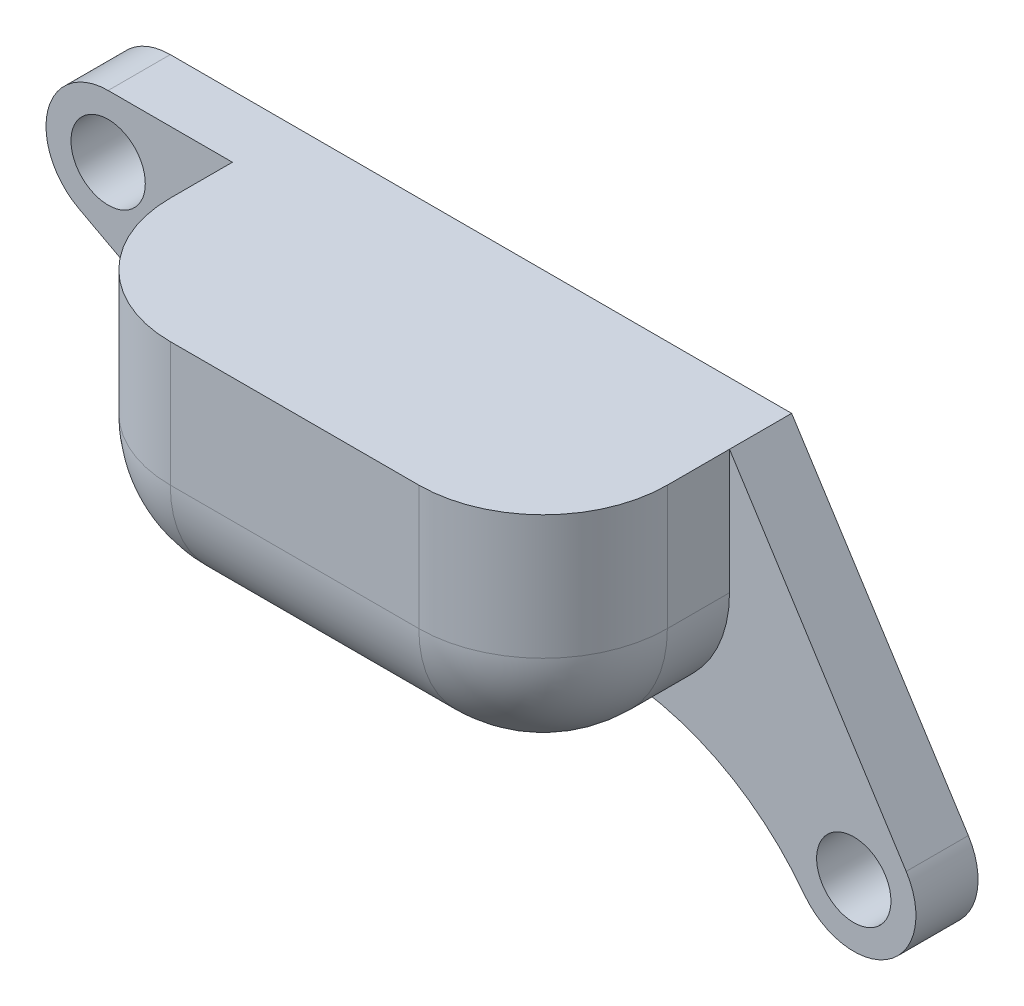
ISO-10303-21;
HEADER;
FILE_DESCRIPTION(('STEP AP214'),'2;1');
FILE_NAME('part.step','',(''),(''),'','','');
FILE_SCHEMA(('AUTOMOTIVE_DESIGN { 1 0 10303 214 1 1 1 1 }'));
ENDSEC;
DATA;
#1=APPLICATION_CONTEXT('core data for automotive mechanical design processes');
#2=APPLICATION_PROTOCOL_DEFINITION('international standard','automotive_design',2000,#1);
#3=PRODUCT_CONTEXT('',#1,'mechanical');
#4=PRODUCT('Part','Part','',(#3));
#5=PRODUCT_RELATED_PRODUCT_CATEGORY('part','',(#4));
#6=PRODUCT_DEFINITION_FORMATION('','',#4);
#7=PRODUCT_DEFINITION_CONTEXT('part definition',#1,'design');
#8=PRODUCT_DEFINITION('design','',#6,#7);
#9=PRODUCT_DEFINITION_SHAPE('','',#8);
#10=(LENGTH_UNIT() NAMED_UNIT(*) SI_UNIT(.MILLI.,.METRE.));
#11=(NAMED_UNIT(*) PLANE_ANGLE_UNIT() SI_UNIT($,.RADIAN.));
#12=(NAMED_UNIT(*) SI_UNIT($,.STERADIAN.) SOLID_ANGLE_UNIT());
#13=UNCERTAINTY_MEASURE_WITH_UNIT(LENGTH_MEASURE(1.E-05),#10,'distance_accuracy_value','');
#14=(GEOMETRIC_REPRESENTATION_CONTEXT(3) GLOBAL_UNCERTAINTY_ASSIGNED_CONTEXT((#13)) GLOBAL_UNIT_ASSIGNED_CONTEXT((#10,
#11,#12)) REPRESENTATION_CONTEXT('',''));
#15=CARTESIAN_POINT('',(0.,0.,0.));
#16=DIRECTION('',(0.,0.,1.));
#17=DIRECTION('',(1.,0.,0.));
#18=AXIS2_PLACEMENT_3D('',#15,#16,#17);
#19=CARTESIAN_POINT('',(12.7,-6.34999999999995,12.7));
#20=DIRECTION('',(-1.,0.,0.));
#21=DIRECTION('',(0.,0.,1.));
#22=AXIS2_PLACEMENT_3D('',#19,#20,#21);
#23=PLANE('',#22);
#24=DIRECTION('',(0.,0.,-1.));
#25=VECTOR('',#24,1.);
#26=CARTESIAN_POINT('',(12.7,0.,12.7));
#27=LINE('',#26,#25);
#28=CARTESIAN_POINT('',(12.7,0.,6.35));
#29=VERTEX_POINT('',#28);
#30=CARTESIAN_POINT('',(12.7,0.,3.175));
#31=VERTEX_POINT('',#30);
#32=EDGE_CURVE('E226',#29,#31,#27,.T.);
#33=ORIENTED_EDGE('',*,*,#32,.F.);
#34=DIRECTION('',(0.,1.,0.));
#35=VECTOR('',#34,1.);
#36=CARTESIAN_POINT('',(12.7,-6.35,6.35));
#37=LINE('',#36,#35);
#38=CARTESIAN_POINT('',(12.7,-6.35,6.35));
#39=VERTEX_POINT('',#38);
#40=EDGE_CURVE('E239',#29,#39,#37,.F.);
#41=ORIENTED_EDGE('',*,*,#40,.T.);
#42=DIRECTION('',(0.,0.,-1.));
#43=VECTOR('',#42,1.);
#44=CARTESIAN_POINT('',(12.7,-6.35,12.7));
#45=LINE('',#44,#43);
#46=CARTESIAN_POINT('',(12.7,-6.35,3.175));
#47=VERTEX_POINT('',#46);
#48=EDGE_CURVE('E210',#39,#47,#45,.T.);
#49=ORIENTED_EDGE('',*,*,#48,.T.);
#50=DIRECTION('',(0.,1.,0.));
#51=VECTOR('',#50,1.);
#52=CARTESIAN_POINT('',(12.7,-6.35,3.175));
#53=LINE('',#52,#51);
#54=EDGE_CURVE('E160',#47,#31,#53,.T.);
#55=ORIENTED_EDGE('',*,*,#54,.T.);
#56=EDGE_LOOP('',(#33,#41,#49,#55));
#57=FACE_BOUND('',#56,.T.);
#58=ADVANCED_FACE('F32',(#57),#23,.F.);
#59=CARTESIAN_POINT('',(6.35,-6.35,12.7));
#60=DIRECTION('',(0.,0.,-1.));
#61=DIRECTION('',(-1.,0.,0.));
#62=AXIS2_PLACEMENT_3D('',#59,#60,#61);
#63=CYLINDRICAL_SURFACE('',#62,6.35);
#64=ORIENTED_EDGE('',*,*,#48,.F.);
#65=CARTESIAN_POINT('',(6.35,-6.35,6.35));
#66=DIRECTION('',(0.,0.,-1.));
#67=DIRECTION('',(-1.,0.,0.));
#68=AXIS2_PLACEMENT_3D('',#65,#66,#67);
#69=CIRCLE('',#68,6.35);
#70=CARTESIAN_POINT('',(6.34999999999995,-12.7,6.35));
#71=VERTEX_POINT('',#70);
#72=EDGE_CURVE('E241',#39,#71,#69,.T.);
#73=ORIENTED_EDGE('',*,*,#72,.T.);
#74=DIRECTION('',(0.,0.,-1.));
#75=VECTOR('',#74,1.);
#76=CARTESIAN_POINT('',(6.34999999999995,-12.7,12.7));
#77=LINE('',#76,#75);
#78=CARTESIAN_POINT('',(6.34999999999995,-12.7,3.175));
#79=VERTEX_POINT('',#78);
#80=EDGE_CURVE('E218',#71,#79,#77,.T.);
#81=ORIENTED_EDGE('',*,*,#80,.T.);
#82=CARTESIAN_POINT('',(6.35,-6.35,3.175));
#83=DIRECTION('',(0.,0.,1.));
#84=DIRECTION('',(-1.,0.,0.));
#85=AXIS2_PLACEMENT_3D('',#82,#83,#84);
#86=CIRCLE('',#85,6.35);
#87=EDGE_CURVE('E163',#79,#47,#86,.T.);
#88=ORIENTED_EDGE('',*,*,#87,.T.);
#89=EDGE_LOOP('',(#64,#73,#81,#88));
#90=FACE_BOUND('',#89,.T.);
#91=ADVANCED_FACE('F325',(#90),#63,.T.);
#92=CARTESIAN_POINT('',(-12.7,0.,12.7));
#93=DIRECTION('',(1.,0.,0.));
#94=DIRECTION('',(0.,1.,0.));
#95=AXIS2_PLACEMENT_3D('',#92,#93,#94);
#96=PLANE('',#95);
#97=DIRECTION('',(0.,0.,-1.));
#98=VECTOR('',#97,1.);
#99=CARTESIAN_POINT('',(-12.7,-6.34999999999995,12.7));
#100=LINE('',#99,#98);
#101=CARTESIAN_POINT('',(-12.7,-6.34999999999995,6.35));
#102=VERTEX_POINT('',#101);
#103=CARTESIAN_POINT('',(-12.7,-6.34999999999995,3.175));
#104=VERTEX_POINT('',#103);
#105=EDGE_CURVE('E222',#102,#104,#100,.T.);
#106=ORIENTED_EDGE('',*,*,#105,.F.);
#107=DIRECTION('',(0.,-1.,0.));
#108=VECTOR('',#107,1.);
#109=CARTESIAN_POINT('',(-12.7,0.,6.35));
#110=LINE('',#109,#108);
#111=CARTESIAN_POINT('',(-12.7,0.,6.35));
#112=VERTEX_POINT('',#111);
#113=EDGE_CURVE('E11',#102,#112,#110,.F.);
#114=ORIENTED_EDGE('',*,*,#113,.T.);
#115=DIRECTION('',(0.,0.,-1.));
#116=VECTOR('',#115,1.);
#117=CARTESIAN_POINT('',(-12.7,0.,12.7));
#118=LINE('',#117,#116);
#119=CARTESIAN_POINT('',(-12.7,0.,3.175));
#120=VERTEX_POINT('',#119);
#121=EDGE_CURVE('E224',#112,#120,#118,.T.);
#122=ORIENTED_EDGE('',*,*,#121,.T.);
#123=DIRECTION('',(0.,-1.,0.));
#124=VECTOR('',#123,1.);
#125=CARTESIAN_POINT('',(-12.7,0.,3.175));
#126=LINE('',#125,#124);
#127=EDGE_CURVE('E192',#120,#104,#126,.T.);
#128=ORIENTED_EDGE('',*,*,#127,.T.);
#129=EDGE_LOOP('',(#106,#114,#122,#128));
#130=FACE_BOUND('',#129,.T.);
#131=ADVANCED_FACE('F266',(#130),#96,.F.);
#132=CARTESIAN_POINT('',(-12.7,0.,12.7));
#133=DIRECTION('',(0.,-1.,0.));
#134=DIRECTION('',(0.,0.,-1.));
#135=AXIS2_PLACEMENT_3D('',#132,#133,#134);
#136=PLANE('',#135);
#137=DIRECTION('',(-1.,0.,0.));
#138=VECTOR('',#137,1.);
#139=CARTESIAN_POINT('',(-12.7,0.,12.7));
#140=LINE('',#139,#138);
#141=CARTESIAN_POINT('',(6.35,0.,12.7));
#142=VERTEX_POINT('',#141);
#143=CARTESIAN_POINT('',(-6.35,0.,12.7));
#144=VERTEX_POINT('',#143);
#145=EDGE_CURVE('E207',#142,#144,#140,.T.);
#146=ORIENTED_EDGE('',*,*,#145,.F.);
#147=CARTESIAN_POINT('',(6.35,0.,6.35));
#148=DIRECTION('',(0.,-1.,0.));
#149=DIRECTION('',(0.,0.,-1.));
#150=AXIS2_PLACEMENT_3D('',#147,#148,#149);
#151=CIRCLE('',#150,6.35);
#152=EDGE_CURVE('E237',#142,#29,#151,.F.);
#153=ORIENTED_EDGE('',*,*,#152,.T.);
#154=ORIENTED_EDGE('',*,*,#32,.T.);
#155=DIRECTION('',(0.,0.,-1.));
#156=VECTOR('',#155,1.);
#157=CARTESIAN_POINT('',(12.7,0.,3.175));
#158=LINE('',#157,#156);
#159=CARTESIAN_POINT('',(12.7,0.,0.));
#160=VERTEX_POINT('',#159);
#161=EDGE_CURVE('E146',#31,#160,#158,.T.);
#162=ORIENTED_EDGE('',*,*,#161,.T.);
#163=DIRECTION('',(-1.,0.,0.));
#164=VECTOR('',#163,1.);
#165=CARTESIAN_POINT('',(-12.7,0.,0.));
#166=LINE('',#165,#164);
#167=CARTESIAN_POINT('',(-19.05,0.,0.));
#168=VERTEX_POINT('',#167);
#169=EDGE_CURVE('E203',#160,#168,#166,.T.);
#170=ORIENTED_EDGE('',*,*,#169,.T.);
#171=DIRECTION('',(0.,0.,-1.));
#172=VECTOR('',#171,1.);
#173=CARTESIAN_POINT('',(-19.05,0.,3.175));
#174=LINE('',#173,#172);
#175=CARTESIAN_POINT('',(-19.05,0.,3.175));
#176=VERTEX_POINT('',#175);
#177=EDGE_CURVE('E200',#176,#168,#174,.T.);
#178=ORIENTED_EDGE('',*,*,#177,.F.);
#179=DIRECTION('',(1.,0.,0.));
#180=VECTOR('',#179,1.);
#181=CARTESIAN_POINT('',(-12.7,0.,3.175));
#182=LINE('',#181,#180);
#183=EDGE_CURVE('E189',#176,#120,#182,.T.);
#184=ORIENTED_EDGE('',*,*,#183,.T.);
#185=ORIENTED_EDGE('',*,*,#121,.F.);
#186=CARTESIAN_POINT('',(-6.35,0.,6.35));
#187=DIRECTION('',(0.,-1.,0.));
#188=DIRECTION('',(0.,0.,-1.));
#189=AXIS2_PLACEMENT_3D('',#186,#187,#188);
#190=CIRCLE('',#189,6.35);
#191=EDGE_CURVE('E235',#112,#144,#190,.F.);
#192=ORIENTED_EDGE('',*,*,#191,.T.);
#193=EDGE_LOOP('',(#146,#153,#154,#162,#170,#178,#184,#185,#192));
#194=FACE_BOUND('',#193,.T.);
#195=ADVANCED_FACE('F269',(#194),#136,.F.);
#196=CARTESIAN_POINT('',(-6.35,-6.35,12.7));
#197=DIRECTION('',(0.,0.,-1.));
#198=DIRECTION('',(-1.,0.,0.));
#199=AXIS2_PLACEMENT_3D('',#196,#197,#198);
#200=CYLINDRICAL_SURFACE('',#199,6.35);
#201=DIRECTION('',(0.,0.,-1.));
#202=VECTOR('',#201,1.);
#203=CARTESIAN_POINT('',(-6.34999999999995,-12.7,12.7));
#204=LINE('',#203,#202);
#205=CARTESIAN_POINT('',(-6.34999999999995,-12.7,6.35));
#206=VERTEX_POINT('',#205);
#207=CARTESIAN_POINT('',(-6.34999999999995,-12.7,0.));
#208=VERTEX_POINT('',#207);
#209=EDGE_CURVE('E220',#206,#208,#204,.T.);
#210=ORIENTED_EDGE('',*,*,#209,.F.);
#211=CARTESIAN_POINT('',(-6.35,-6.35,6.35));
#212=DIRECTION('',(0.,0.,-1.));
#213=DIRECTION('',(-1.,0.,0.));
#214=AXIS2_PLACEMENT_3D('',#211,#212,#213);
#215=CIRCLE('',#214,6.35);
#216=EDGE_CURVE('E41',#206,#102,#215,.T.);
#217=ORIENTED_EDGE('',*,*,#216,.T.);
#218=ORIENTED_EDGE('',*,*,#105,.T.);
#219=CARTESIAN_POINT('',(-6.35,-6.35,3.175));
#220=DIRECTION('',(0.,0.,1.));
#221=DIRECTION('',(-1.,0.,0.));
#222=AXIS2_PLACEMENT_3D('',#219,#220,#221);
#223=CIRCLE('',#222,6.35);
#224=CARTESIAN_POINT('',(-9.33823529411765,-11.9529411764706,3.175));
#225=VERTEX_POINT('',#224);
#226=EDGE_CURVE('E180',#104,#225,#223,.T.);
#227=ORIENTED_EDGE('',*,*,#226,.T.);
#228=DIRECTION('',(0.,0.,-1.));
#229=VECTOR('',#228,1.);
#230=CARTESIAN_POINT('',(-9.33823529411765,-11.9529411764706,3.175));
#231=LINE('',#230,#229);
#232=CARTESIAN_POINT('',(-9.33823529411765,-11.9529411764706,0.));
#233=VERTEX_POINT('',#232);
#234=EDGE_CURVE('E195',#225,#233,#231,.T.);
#235=ORIENTED_EDGE('',*,*,#234,.T.);
#236=CARTESIAN_POINT('',(-6.35,-6.35,0.));
#237=DIRECTION('',(0.,0.,1.));
#238=DIRECTION('',(1.,0.,0.));
#239=AXIS2_PLACEMENT_3D('',#236,#237,#238);
#240=CIRCLE('',#239,6.35);
#241=EDGE_CURVE('E213',#233,#208,#240,.T.);
#242=ORIENTED_EDGE('',*,*,#241,.T.);
#243=EDGE_LOOP('',(#210,#217,#218,#227,#235,#242));
#244=FACE_BOUND('',#243,.T.);
#245=ADVANCED_FACE('F278',(#244),#200,.T.);
#246=CARTESIAN_POINT('',(-6.34999999999995,-12.7,12.7));
#247=DIRECTION('',(0.,1.,0.));
#248=DIRECTION('',(-1.,0.,0.));
#249=AXIS2_PLACEMENT_3D('',#246,#247,#248);
#250=PLANE('',#249);
#251=ORIENTED_EDGE('',*,*,#80,.F.);
#252=DIRECTION('',(1.,0.,0.));
#253=VECTOR('',#252,1.);
#254=CARTESIAN_POINT('',(-6.34999999999995,-12.7,6.35));
#255=LINE('',#254,#253);
#256=EDGE_CURVE('E56',#71,#206,#255,.F.);
#257=ORIENTED_EDGE('',*,*,#256,.T.);
#258=ORIENTED_EDGE('',*,*,#209,.T.);
#259=DIRECTION('',(1.,0.,0.));
#260=VECTOR('',#259,1.);
#261=CARTESIAN_POINT('',(-6.34999999999995,-12.7,0.));
#262=LINE('',#261,#260);
#263=CARTESIAN_POINT('',(6.34999999999995,-12.7,0.));
#264=VERTEX_POINT('',#263);
#265=EDGE_CURVE('E211',#208,#264,#262,.T.);
#266=ORIENTED_EDGE('',*,*,#265,.T.);
#267=DIRECTION('',(0.,0.,-1.));
#268=VECTOR('',#267,1.);
#269=CARTESIAN_POINT('',(6.34999999999996,-12.7,3.175));
#270=LINE('',#269,#268);
#271=EDGE_CURVE('E174',#79,#264,#270,.T.);
#272=ORIENTED_EDGE('',*,*,#271,.F.);
#273=EDGE_LOOP('',(#251,#257,#258,#266,#272));
#274=FACE_BOUND('',#273,.T.);
#275=ADVANCED_FACE('F287',(#274),#250,.F.);
#276=CARTESIAN_POINT('',(-6.35,-6.35,12.7));
#277=DIRECTION('',(0.,0.,1.));
#278=DIRECTION('',(1.,0.,0.));
#279=AXIS2_PLACEMENT_3D('',#276,#277,#278);
#280=PLANE('',#279);
#281=DIRECTION('',(1.,0.,0.));
#282=VECTOR('',#281,1.);
#283=CARTESIAN_POINT('',(6.34999999999995,-6.35,12.7));
#284=LINE('',#283,#282);
#285=CARTESIAN_POINT('',(-6.35,-6.35,12.7));
#286=VERTEX_POINT('',#285);
#287=CARTESIAN_POINT('',(6.35,-6.35,12.7));
#288=VERTEX_POINT('',#287);
#289=EDGE_CURVE('E230',#286,#288,#284,.T.);
#290=ORIENTED_EDGE('',*,*,#289,.T.);
#291=DIRECTION('',(0.,1.,0.));
#292=VECTOR('',#291,1.);
#293=CARTESIAN_POINT('',(6.35,0.,12.7));
#294=LINE('',#293,#292);
#295=EDGE_CURVE('E232',#288,#142,#294,.T.);
#296=ORIENTED_EDGE('',*,*,#295,.T.);
#297=ORIENTED_EDGE('',*,*,#145,.T.);
#298=DIRECTION('',(0.,-1.,0.));
#299=VECTOR('',#298,1.);
#300=CARTESIAN_POINT('',(-6.35,-6.34999999999995,12.7));
#301=LINE('',#300,#299);
#302=EDGE_CURVE('E228',#144,#286,#301,.T.);
#303=ORIENTED_EDGE('',*,*,#302,.T.);
#304=EDGE_LOOP('',(#290,#296,#297,#303));
#305=FACE_BOUND('',#304,.T.);
#306=ADVANCED_FACE('F415',(#305),#280,.T.);
#307=CARTESIAN_POINT('',(-6.35,-6.35,0.));
#308=DIRECTION('',(0.,0.,1.));
#309=DIRECTION('',(1.,0.,0.));
#310=AXIS2_PLACEMENT_3D('',#307,#308,#309);
#311=PLANE('',#310);
#312=CARTESIAN_POINT('',(-19.05,-3.175,0.));
#313=DIRECTION('',(0.,0.,1.));
#314=DIRECTION('',(1.,0.,0.));
#315=AXIS2_PLACEMENT_3D('',#312,#313,#314);
#316=CIRCLE('',#315,1.89865);
#317=CARTESIAN_POINT('',(-17.15135,-3.175,0.));
#318=VERTEX_POINT('',#317);
#319=EDGE_CURVE('E304',#318,#318,#316,.T.);
#320=ORIENTED_EDGE('',*,*,#319,.T.);
#321=EDGE_LOOP('',(#320));
#322=FACE_BOUND('',#321,.T.);
#323=CARTESIAN_POINT('',(19.05,-15.875,0.));
#324=DIRECTION('',(0.,0.,1.));
#325=DIRECTION('',(1.,0.,0.));
#326=AXIS2_PLACEMENT_3D('',#323,#324,#325);
#327=CIRCLE('',#326,1.89865);
#328=CARTESIAN_POINT('',(20.94865,-15.875,0.));
#329=VERTEX_POINT('',#328);
#330=EDGE_CURVE('E249',#329,#329,#327,.T.);
#331=ORIENTED_EDGE('',*,*,#330,.T.);
#332=EDGE_LOOP('',(#331));
#333=FACE_BOUND('',#332,.T.);
#334=ORIENTED_EDGE('',*,*,#241,.F.);
#335=DIRECTION('',(-0.88235294117647,0.470588235294118,0.));
#336=VECTOR('',#335,1.);
#337=CARTESIAN_POINT('',(-9.33823529411765,-11.9529411764706,0.));
#338=LINE('',#337,#336);
#339=CARTESIAN_POINT('',(-20.5441176470588,-5.97647058823529,0.));
#340=VERTEX_POINT('',#339);
#341=EDGE_CURVE('E177',#233,#340,#338,.T.);
#342=ORIENTED_EDGE('',*,*,#341,.T.);
#343=CARTESIAN_POINT('',(-19.05,-3.175,0.));
#344=DIRECTION('',(0.,0.,-1.));
#345=DIRECTION('',(1.,0.,0.));
#346=AXIS2_PLACEMENT_3D('',#343,#344,#345);
#347=CIRCLE('',#346,3.175);
#348=EDGE_CURVE('E183',#340,#168,#347,.T.);
#349=ORIENTED_EDGE('',*,*,#348,.T.);
#350=ORIENTED_EDGE('',*,*,#169,.F.);
#351=DIRECTION('',(0.537345008422702,-0.843362521056755,0.));
#352=VECTOR('',#351,1.);
#353=CARTESIAN_POINT('',(12.7,0.,0.));
#354=LINE('',#353,#352);
#355=CARTESIAN_POINT('',(21.7276760043552,-14.1689295982579,0.));
#356=VERTEX_POINT('',#355);
#357=EDGE_CURVE('E168',#160,#356,#354,.T.);
#358=ORIENTED_EDGE('',*,*,#357,.T.);
#359=CARTESIAN_POINT('',(19.05,-15.875,0.));
#360=DIRECTION('',(0.,0.,-1.));
#361=DIRECTION('',(-1.,0.,0.));
#362=AXIS2_PLACEMENT_3D('',#359,#360,#361);
#363=CIRCLE('',#362,3.175);
#364=CARTESIAN_POINT('',(16.51,-17.78,0.));
#365=VERTEX_POINT('',#364);
#366=EDGE_CURVE('E140',#356,#365,#363,.T.);
#367=ORIENTED_EDGE('',*,*,#366,.T.);
#368=CARTESIAN_POINT('',(6.34999999999986,-25.4000000000003,0.));
#369=DIRECTION('',(0.,0.,1.));
#370=DIRECTION('',(-1.,0.,0.));
#371=AXIS2_PLACEMENT_3D('',#368,#369,#370);
#372=CIRCLE('',#371,12.7000000000003);
#373=EDGE_CURVE('E171',#365,#264,#372,.T.);
#374=ORIENTED_EDGE('',*,*,#373,.T.);
#375=ORIENTED_EDGE('',*,*,#265,.F.);
#376=EDGE_LOOP('',(#334,#342,#349,#350,#358,#367,#374,#375));
#377=FACE_BOUND('',#376,.T.);
#378=ADVANCED_FACE('F285',(#322,#333,#377),#311,.F.);
#379=CARTESIAN_POINT('',(-19.05,-3.175,3.175));
#380=DIRECTION('',(0.,0.,-1.));
#381=DIRECTION('',(-1.,0.,0.));
#382=AXIS2_PLACEMENT_3D('',#379,#380,#381);
#383=CYLINDRICAL_SURFACE('',#382,3.175);
#384=ORIENTED_EDGE('',*,*,#348,.F.);
#385=DIRECTION('',(0.,0.,-1.));
#386=VECTOR('',#385,1.);
#387=CARTESIAN_POINT('',(-20.5441176470588,-5.97647058823529,3.175));
#388=LINE('',#387,#386);
#389=CARTESIAN_POINT('',(-20.5441176470588,-5.97647058823529,3.175));
#390=VERTEX_POINT('',#389);
#391=EDGE_CURVE('E204',#390,#340,#388,.T.);
#392=ORIENTED_EDGE('',*,*,#391,.F.);
#393=CARTESIAN_POINT('',(-19.05,-3.175,3.175));
#394=DIRECTION('',(0.,0.,-1.));
#395=DIRECTION('',(1.,0.,0.));
#396=AXIS2_PLACEMENT_3D('',#393,#394,#395);
#397=CIRCLE('',#396,3.175);
#398=EDGE_CURVE('E186',#390,#176,#397,.T.);
#399=ORIENTED_EDGE('',*,*,#398,.T.);
#400=ORIENTED_EDGE('',*,*,#177,.T.);
#401=EDGE_LOOP('',(#384,#392,#399,#400));
#402=FACE_BOUND('',#401,.T.);
#403=ADVANCED_FACE('F320',(#402),#383,.T.);
#404=CARTESIAN_POINT('',(-9.33823529411765,-11.9529411764706,3.175));
#405=DIRECTION('',(-0.470588235294118,-0.88235294117647,0.));
#406=DIRECTION('',(0.882352941176471,-0.470588235294118,0.));
#407=AXIS2_PLACEMENT_3D('',#404,#405,#406);
#408=PLANE('',#407);
#409=ORIENTED_EDGE('',*,*,#341,.F.);
#410=ORIENTED_EDGE('',*,*,#234,.F.);
#411=DIRECTION('',(-0.88235294117647,0.470588235294118,0.));
#412=VECTOR('',#411,1.);
#413=CARTESIAN_POINT('',(-9.33823529411765,-11.9529411764706,3.175));
#414=LINE('',#413,#412);
#415=EDGE_CURVE('E182',#225,#390,#414,.T.);
#416=ORIENTED_EDGE('',*,*,#415,.T.);
#417=ORIENTED_EDGE('',*,*,#391,.T.);
#418=EDGE_LOOP('',(#409,#410,#416,#417));
#419=FACE_BOUND('',#418,.T.);
#420=ADVANCED_FACE('F282',(#419),#408,.T.);
#421=CARTESIAN_POINT('',(-6.35,-6.35,3.175));
#422=DIRECTION('',(0.,0.,-1.));
#423=DIRECTION('',(-1.,0.,0.));
#424=AXIS2_PLACEMENT_3D('',#421,#422,#423);
#425=PLANE('',#424);
#426=CARTESIAN_POINT('',(-19.05,-3.175,3.175));
#427=DIRECTION('',(0.,0.,1.));
#428=DIRECTION('',(1.,0.,0.));
#429=AXIS2_PLACEMENT_3D('',#426,#427,#428);
#430=CIRCLE('',#429,1.89865);
#431=CARTESIAN_POINT('',(-17.15135,-3.175,3.175));
#432=VERTEX_POINT('',#431);
#433=EDGE_CURVE('E307',#432,#432,#430,.T.);
#434=ORIENTED_EDGE('',*,*,#433,.F.);
#435=EDGE_LOOP('',(#434));
#436=FACE_BOUND('',#435,.T.);
#437=ORIENTED_EDGE('',*,*,#226,.F.);
#438=ORIENTED_EDGE('',*,*,#127,.F.);
#439=ORIENTED_EDGE('',*,*,#183,.F.);
#440=ORIENTED_EDGE('',*,*,#398,.F.);
#441=ORIENTED_EDGE('',*,*,#415,.F.);
#442=EDGE_LOOP('',(#437,#438,#439,#440,#441));
#443=FACE_BOUND('',#442,.T.);
#444=ADVANCED_FACE('F275',(#436,#443),#425,.F.);
#445=CARTESIAN_POINT('',(6.34999999999986,-25.4000000000003,3.175));
#446=DIRECTION('',(0.,0.,-1.));
#447=DIRECTION('',(-1.,0.,0.));
#448=AXIS2_PLACEMENT_3D('',#445,#446,#447);
#449=CYLINDRICAL_SURFACE('',#448,12.7000000000003);
#450=ORIENTED_EDGE('',*,*,#373,.F.);
#451=DIRECTION('',(0.,0.,-1.));
#452=VECTOR('',#451,1.);
#453=CARTESIAN_POINT('',(16.51,-17.78,3.175));
#454=LINE('',#453,#452);
#455=CARTESIAN_POINT('',(16.51,-17.78,3.175));
#456=VERTEX_POINT('',#455);
#457=EDGE_CURVE('E145',#456,#365,#454,.T.);
#458=ORIENTED_EDGE('',*,*,#457,.F.);
#459=CARTESIAN_POINT('',(6.34999999999986,-25.4000000000003,3.175));
#460=DIRECTION('',(0.,0.,1.));
#461=DIRECTION('',(-1.,0.,0.));
#462=AXIS2_PLACEMENT_3D('',#459,#460,#461);
#463=CIRCLE('',#462,12.7000000000003);
#464=EDGE_CURVE('E155',#456,#79,#463,.T.);
#465=ORIENTED_EDGE('',*,*,#464,.T.);
#466=ORIENTED_EDGE('',*,*,#271,.T.);
#467=EDGE_LOOP('',(#450,#458,#465,#466));
#468=FACE_BOUND('',#467,.T.);
#469=ADVANCED_FACE('F291',(#468),#449,.F.);
#470=CARTESIAN_POINT('',(19.05,-15.875,3.175));
#471=DIRECTION('',(0.,0.,-1.));
#472=DIRECTION('',(-1.,0.,0.));
#473=AXIS2_PLACEMENT_3D('',#470,#471,#472);
#474=CYLINDRICAL_SURFACE('',#473,3.175);
#475=ORIENTED_EDGE('',*,*,#366,.F.);
#476=DIRECTION('',(0.,0.,-1.));
#477=VECTOR('',#476,1.);
#478=CARTESIAN_POINT('',(21.7276760043552,-14.1689295982579,3.175));
#479=LINE('',#478,#477);
#480=CARTESIAN_POINT('',(21.7276760043552,-14.1689295982579,3.175));
#481=VERTEX_POINT('',#480);
#482=EDGE_CURVE('E134',#481,#356,#479,.T.);
#483=ORIENTED_EDGE('',*,*,#482,.F.);
#484=CARTESIAN_POINT('',(19.05,-15.875,3.175));
#485=DIRECTION('',(0.,0.,-1.));
#486=DIRECTION('',(-1.,0.,0.));
#487=AXIS2_PLACEMENT_3D('',#484,#485,#486);
#488=CIRCLE('',#487,3.175);
#489=EDGE_CURVE('E137',#481,#456,#488,.T.);
#490=ORIENTED_EDGE('',*,*,#489,.T.);
#491=ORIENTED_EDGE('',*,*,#457,.T.);
#492=EDGE_LOOP('',(#475,#483,#490,#491));
#493=FACE_BOUND('',#492,.T.);
#494=ADVANCED_FACE('F136',(#493),#474,.T.);
#495=CARTESIAN_POINT('',(12.7,0.,3.175));
#496=DIRECTION('',(0.843362521056755,0.537345008422702,0.));
#497=DIRECTION('',(-0.537345008422702,0.843362521056755,0.));
#498=AXIS2_PLACEMENT_3D('',#495,#496,#497);
#499=PLANE('',#498);
#500=ORIENTED_EDGE('',*,*,#357,.F.);
#501=ORIENTED_EDGE('',*,*,#161,.F.);
#502=DIRECTION('',(0.537345008422702,-0.843362521056755,0.));
#503=VECTOR('',#502,1.);
#504=CARTESIAN_POINT('',(12.7,0.,3.175));
#505=LINE('',#504,#503);
#506=EDGE_CURVE('E153',#31,#481,#505,.T.);
#507=ORIENTED_EDGE('',*,*,#506,.T.);
#508=ORIENTED_EDGE('',*,*,#482,.T.);
#509=EDGE_LOOP('',(#500,#501,#507,#508));
#510=FACE_BOUND('',#509,.T.);
#511=ADVANCED_FACE('F158',(#510),#499,.T.);
#512=CARTESIAN_POINT('',(6.35,-6.35,3.175));
#513=DIRECTION('',(0.,0.,-1.));
#514=DIRECTION('',(-1.,0.,0.));
#515=AXIS2_PLACEMENT_3D('',#512,#513,#514);
#516=PLANE('',#515);
#517=CARTESIAN_POINT('',(19.05,-15.875,3.175));
#518=DIRECTION('',(0.,0.,1.));
#519=DIRECTION('',(1.,0.,0.));
#520=AXIS2_PLACEMENT_3D('',#517,#518,#519);
#521=CIRCLE('',#520,1.89865);
#522=CARTESIAN_POINT('',(20.94865,-15.875,3.175));
#523=VERTEX_POINT('',#522);
#524=EDGE_CURVE('E301',#523,#523,#521,.T.);
#525=ORIENTED_EDGE('',*,*,#524,.F.);
#526=EDGE_LOOP('',(#525));
#527=FACE_BOUND('',#526,.T.);
#528=ORIENTED_EDGE('',*,*,#87,.F.);
#529=ORIENTED_EDGE('',*,*,#464,.F.);
#530=ORIENTED_EDGE('',*,*,#489,.F.);
#531=ORIENTED_EDGE('',*,*,#506,.F.);
#532=ORIENTED_EDGE('',*,*,#54,.F.);
#533=EDGE_LOOP('',(#528,#529,#530,#531,#532));
#534=FACE_BOUND('',#533,.T.);
#535=ADVANCED_FACE('F151',(#527,#534),#516,.F.);
#536=CARTESIAN_POINT('',(-6.35,-6.35,6.35));
#537=DIRECTION('',(0.,1.,0.));
#538=DIRECTION('',(-1.,0.,0.));
#539=AXIS2_PLACEMENT_3D('',#536,#537,#538);
#540=CYLINDRICAL_SURFACE('',#539,6.35);
#541=ORIENTED_EDGE('',*,*,#191,.F.);
#542=ORIENTED_EDGE('',*,*,#113,.F.);
#543=CARTESIAN_POINT('',(-6.35,-6.35,6.35));
#544=DIRECTION('',(0.,-1.,0.));
#545=DIRECTION('',(1.,0.,0.));
#546=AXIS2_PLACEMENT_3D('',#543,#544,#545);
#547=CIRCLE('',#546,6.35);
#548=EDGE_CURVE('E36',#286,#102,#547,.T.);
#549=ORIENTED_EDGE('',*,*,#548,.F.);
#550=ORIENTED_EDGE('',*,*,#302,.F.);
#551=EDGE_LOOP('',(#541,#542,#549,#550));
#552=FACE_BOUND('',#551,.T.);
#553=ADVANCED_FACE('F34',(#552),#540,.T.);
#554=CARTESIAN_POINT('',(-6.35,-6.35,6.35));
#555=DIRECTION('',(0.,0.,1.));
#556=DIRECTION('',(1.,0.,0.));
#557=AXIS2_PLACEMENT_3D('',#554,#555,#556);
#558=SPHERICAL_SURFACE('',#557,6.35);
#559=ORIENTED_EDGE('',*,*,#548,.T.);
#560=ORIENTED_EDGE('',*,*,#216,.F.);
#561=CARTESIAN_POINT('',(-6.35,-6.35,6.35));
#562=DIRECTION('',(1.,0.,0.));
#563=DIRECTION('',(0.,1.,0.));
#564=AXIS2_PLACEMENT_3D('',#561,#562,#563);
#565=CIRCLE('',#564,6.35);
#566=EDGE_CURVE('E251',#286,#206,#565,.T.);
#567=ORIENTED_EDGE('',*,*,#566,.F.);
#568=EDGE_LOOP('',(#559,#560,#567));
#569=FACE_BOUND('',#568,.T.);
#570=ADVANCED_FACE('F259',(#569),#558,.T.);
#571=CARTESIAN_POINT('',(-6.35,-6.35,6.35));
#572=DIRECTION('',(-1.,0.,0.));
#573=DIRECTION('',(0.,-1.,0.));
#574=AXIS2_PLACEMENT_3D('',#571,#572,#573);
#575=CYLINDRICAL_SURFACE('',#574,6.35);
#576=ORIENTED_EDGE('',*,*,#566,.T.);
#577=ORIENTED_EDGE('',*,*,#256,.F.);
#578=CARTESIAN_POINT('',(6.35,-6.35,6.35));
#579=DIRECTION('',(1.,0.,0.));
#580=DIRECTION('',(0.,1.,0.));
#581=AXIS2_PLACEMENT_3D('',#578,#579,#580);
#582=CIRCLE('',#581,6.35);
#583=EDGE_CURVE('E248',#288,#71,#582,.T.);
#584=ORIENTED_EDGE('',*,*,#583,.F.);
#585=ORIENTED_EDGE('',*,*,#289,.F.);
#586=EDGE_LOOP('',(#576,#577,#584,#585));
#587=FACE_BOUND('',#586,.T.);
#588=ADVANCED_FACE('F342',(#587),#575,.T.);
#589=CARTESIAN_POINT('',(6.35,-6.35,6.35));
#590=DIRECTION('',(0.,0.,1.));
#591=DIRECTION('',(1.,0.,0.));
#592=AXIS2_PLACEMENT_3D('',#589,#590,#591);
#593=SPHERICAL_SURFACE('',#592,6.35);
#594=ORIENTED_EDGE('',*,*,#583,.T.);
#595=ORIENTED_EDGE('',*,*,#72,.F.);
#596=CARTESIAN_POINT('',(6.35,-6.35,6.35));
#597=DIRECTION('',(0.,1.,0.));
#598=DIRECTION('',(0.,0.,1.));
#599=AXIS2_PLACEMENT_3D('',#596,#597,#598);
#600=CIRCLE('',#599,6.35);
#601=EDGE_CURVE('E245',#288,#39,#600,.T.);
#602=ORIENTED_EDGE('',*,*,#601,.F.);
#603=EDGE_LOOP('',(#594,#595,#602));
#604=FACE_BOUND('',#603,.T.);
#605=ADVANCED_FACE('F338',(#604),#593,.T.);
#606=CARTESIAN_POINT('',(6.35,-6.35,6.35));
#607=DIRECTION('',(0.,-1.,0.));
#608=DIRECTION('',(0.,0.,-1.));
#609=AXIS2_PLACEMENT_3D('',#606,#607,#608);
#610=CYLINDRICAL_SURFACE('',#609,6.35);
#611=ORIENTED_EDGE('',*,*,#601,.T.);
#612=ORIENTED_EDGE('',*,*,#40,.F.);
#613=ORIENTED_EDGE('',*,*,#152,.F.);
#614=ORIENTED_EDGE('',*,*,#295,.F.);
#615=EDGE_LOOP('',(#611,#612,#613,#614));
#616=FACE_BOUND('',#615,.T.);
#617=ADVANCED_FACE('F334',(#616),#610,.T.);
#618=CARTESIAN_POINT('',(19.05,-15.875,3.175));
#619=DIRECTION('',(0.,0.,1.));
#620=DIRECTION('',(1.,0.,0.));
#621=AXIS2_PLACEMENT_3D('',#618,#619,#620);
#622=CYLINDRICAL_SURFACE('',#621,1.89865);
#623=ORIENTED_EDGE('',*,*,#330,.F.);
#624=EDGE_LOOP('',(#623));
#625=FACE_BOUND('',#624,.T.);
#626=ORIENTED_EDGE('',*,*,#524,.T.);
#627=EDGE_LOOP('',(#626));
#628=FACE_BOUND('',#627,.T.);
#629=ADVANCED_FACE('F337',(#625,#628),#622,.F.);
#630=CARTESIAN_POINT('',(-19.05,-3.175,3.175));
#631=DIRECTION('',(0.,0.,1.));
#632=DIRECTION('',(1.,0.,0.));
#633=AXIS2_PLACEMENT_3D('',#630,#631,#632);
#634=CYLINDRICAL_SURFACE('',#633,1.89865);
#635=ORIENTED_EDGE('',*,*,#319,.F.);
#636=EDGE_LOOP('',(#635));
#637=FACE_BOUND('',#636,.T.);
#638=ORIENTED_EDGE('',*,*,#433,.T.);
#639=EDGE_LOOP('',(#638));
#640=FACE_BOUND('',#639,.T.);
#641=ADVANCED_FACE('F311',(#637,#640),#634,.F.);
#642=CLOSED_SHELL('',(#58,#91,#131,#195,#245,#275,#306,#378,#403,#420,#444,#469,#494,#511,#535,
#553,#570,#588,#605,#617,#629,#641));
#643=MANIFOLD_SOLID_BREP('B2',#642);
#644=ADVANCED_BREP_SHAPE_REPRESENTATION('',(#18,#643),#14);
#645=SHAPE_DEFINITION_REPRESENTATION(#9,#644);
ENDSEC;
END-ISO-10303-21;
